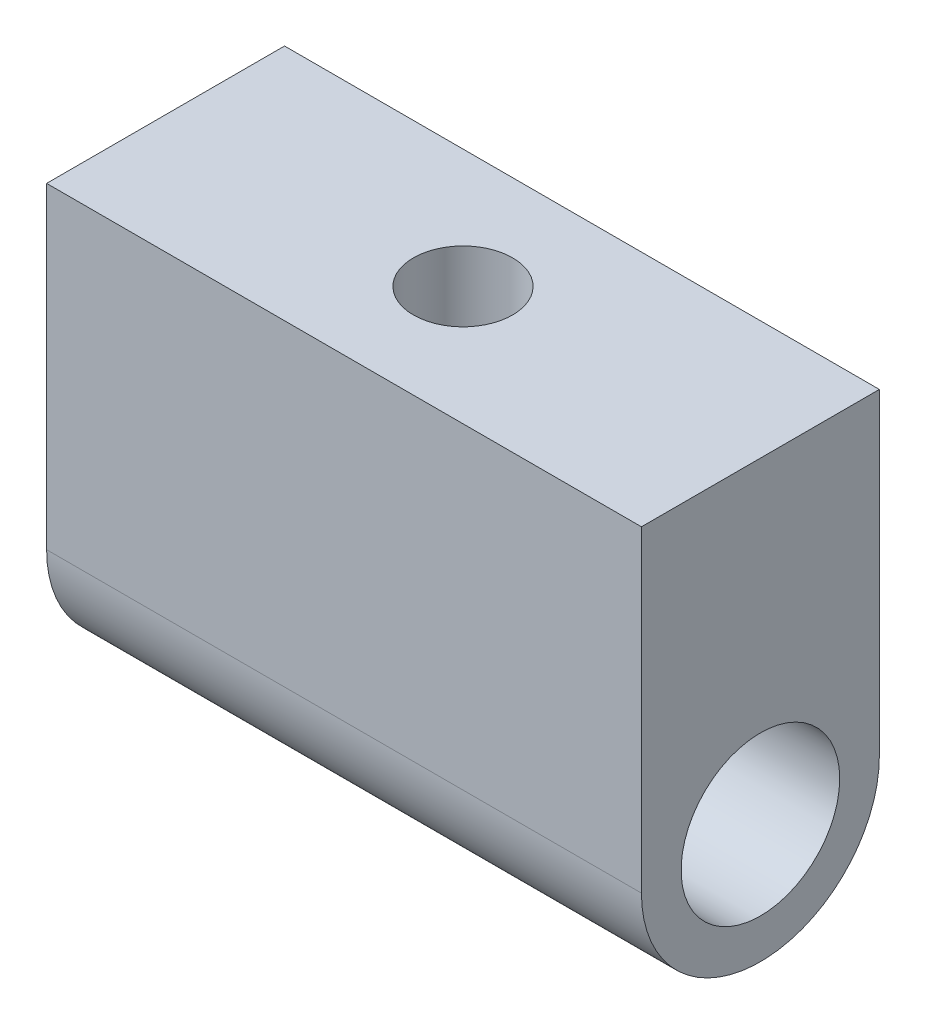
ISO-10303-21;
HEADER;
FILE_DESCRIPTION(('STEP AP214'),'2;1');
FILE_NAME('part.step','',(''),(''),'','','');
FILE_SCHEMA(('AUTOMOTIVE_DESIGN { 1 0 10303 214 1 1 1 1 }'));
ENDSEC;
DATA;
#1=APPLICATION_CONTEXT('core data for automotive mechanical design processes');
#2=APPLICATION_PROTOCOL_DEFINITION('international standard','automotive_design',2000,#1);
#3=PRODUCT_CONTEXT('',#1,'mechanical');
#4=PRODUCT('Part','Part','',(#3));
#5=PRODUCT_RELATED_PRODUCT_CATEGORY('part','',(#4));
#6=PRODUCT_DEFINITION_FORMATION('','',#4);
#7=PRODUCT_DEFINITION_CONTEXT('part definition',#1,'design');
#8=PRODUCT_DEFINITION('design','',#6,#7);
#9=PRODUCT_DEFINITION_SHAPE('','',#8);
#10=(LENGTH_UNIT() NAMED_UNIT(*) SI_UNIT(.MILLI.,.METRE.));
#11=(NAMED_UNIT(*) PLANE_ANGLE_UNIT() SI_UNIT($,.RADIAN.));
#12=(NAMED_UNIT(*) SI_UNIT($,.STERADIAN.) SOLID_ANGLE_UNIT());
#13=UNCERTAINTY_MEASURE_WITH_UNIT(LENGTH_MEASURE(1.E-05),#10,'distance_accuracy_value','');
#14=(GEOMETRIC_REPRESENTATION_CONTEXT(3) GLOBAL_UNCERTAINTY_ASSIGNED_CONTEXT((#13)) GLOBAL_UNIT_ASSIGNED_CONTEXT((#10,
#11,#12)) REPRESENTATION_CONTEXT('',''));
#15=CARTESIAN_POINT('',(0.,0.,0.));
#16=DIRECTION('',(0.,0.,1.));
#17=DIRECTION('',(1.,0.,0.));
#18=AXIS2_PLACEMENT_3D('',#15,#16,#17);
#19=CARTESIAN_POINT('',(30.,-8.,0.));
#20=DIRECTION('',(1.,0.,0.));
#21=DIRECTION('',(0.,0.,-1.));
#22=AXIS2_PLACEMENT_3D('',#19,#20,#21);
#23=PLANE('',#22);
#24=CARTESIAN_POINT('',(30.,-8.,0.));
#25=DIRECTION('',(1.,0.,0.));
#26=DIRECTION('',(0.,0.,-1.));
#27=AXIS2_PLACEMENT_3D('',#24,#25,#26);
#28=CIRCLE('',#27,6.);
#29=CARTESIAN_POINT('',(30.,-8.,6.));
#30=VERTEX_POINT('',#29);
#31=CARTESIAN_POINT('',(30.,-8.,-6.));
#32=VERTEX_POINT('',#31);
#33=EDGE_CURVE('E91',#30,#32,#28,.T.);
#34=ORIENTED_EDGE('',*,*,#33,.T.);
#35=DIRECTION('',(0.,1.,0.));
#36=VECTOR('',#35,1.);
#37=CARTESIAN_POINT('',(30.,8.,-6.));
#38=LINE('',#37,#36);
#39=CARTESIAN_POINT('',(30.,8.,-6.));
#40=VERTEX_POINT('',#39);
#41=EDGE_CURVE('E86',#32,#40,#38,.T.);
#42=ORIENTED_EDGE('',*,*,#41,.T.);
#43=DIRECTION('',(0.,0.,1.));
#44=VECTOR('',#43,1.);
#45=CARTESIAN_POINT('',(30.,8.,6.));
#46=LINE('',#45,#44);
#47=CARTESIAN_POINT('',(30.,8.,6.));
#48=VERTEX_POINT('',#47);
#49=EDGE_CURVE('E89',#40,#48,#46,.T.);
#50=ORIENTED_EDGE('',*,*,#49,.T.);
#51=DIRECTION('',(0.,-1.,0.));
#52=VECTOR('',#51,1.);
#53=CARTESIAN_POINT('',(30.,8.,6.));
#54=LINE('',#53,#52);
#55=EDGE_CURVE('E56',#48,#30,#54,.T.);
#56=ORIENTED_EDGE('',*,*,#55,.T.);
#57=EDGE_LOOP('',(#34,#42,#50,#56));
#58=FACE_BOUND('',#57,.T.);
#59=CARTESIAN_POINT('',(30.,-8.,0.));
#60=DIRECTION('',(1.,0.,0.));
#61=DIRECTION('',(0.,0.,-1.));
#62=AXIS2_PLACEMENT_3D('',#59,#60,#61);
#63=CIRCLE('',#62,4.);
#64=CARTESIAN_POINT('',(30.,-8.,-4.));
#65=VERTEX_POINT('',#64);
#66=EDGE_CURVE('E106',#65,#65,#63,.T.);
#67=ORIENTED_EDGE('',*,*,#66,.F.);
#68=EDGE_LOOP('',(#67));
#69=FACE_BOUND('',#68,.T.);
#70=ADVANCED_FACE('F39',(#58,#69),#23,.T.);
#71=CARTESIAN_POINT('',(0.,-8.,0.));
#72=DIRECTION('',(1.,0.,0.));
#73=DIRECTION('',(0.,0.,-1.));
#74=AXIS2_PLACEMENT_3D('',#71,#72,#73);
#75=PLANE('',#74);
#76=CARTESIAN_POINT('',(0.,-8.,0.));
#77=DIRECTION('',(1.,0.,0.));
#78=DIRECTION('',(0.,0.,-1.));
#79=AXIS2_PLACEMENT_3D('',#76,#77,#78);
#80=CIRCLE('',#79,6.);
#81=CARTESIAN_POINT('',(0.,-8.,6.));
#82=VERTEX_POINT('',#81);
#83=CARTESIAN_POINT('',(0.,-8.,-6.));
#84=VERTEX_POINT('',#83);
#85=EDGE_CURVE('E103',#82,#84,#80,.T.);
#86=ORIENTED_EDGE('',*,*,#85,.F.);
#87=DIRECTION('',(0.,-1.,0.));
#88=VECTOR('',#87,1.);
#89=CARTESIAN_POINT('',(0.,8.,6.));
#90=LINE('',#89,#88);
#91=CARTESIAN_POINT('',(0.,8.,6.));
#92=VERTEX_POINT('',#91);
#93=EDGE_CURVE('E79',#92,#82,#90,.T.);
#94=ORIENTED_EDGE('',*,*,#93,.F.);
#95=DIRECTION('',(0.,0.,1.));
#96=VECTOR('',#95,1.);
#97=CARTESIAN_POINT('',(0.,8.,6.));
#98=LINE('',#97,#96);
#99=CARTESIAN_POINT('',(0.,8.,-6.));
#100=VERTEX_POINT('',#99);
#101=EDGE_CURVE('E73',#100,#92,#98,.T.);
#102=ORIENTED_EDGE('',*,*,#101,.F.);
#103=DIRECTION('',(0.,1.,0.));
#104=VECTOR('',#103,1.);
#105=CARTESIAN_POINT('',(0.,8.,-6.));
#106=LINE('',#105,#104);
#107=EDGE_CURVE('E95',#84,#100,#106,.T.);
#108=ORIENTED_EDGE('',*,*,#107,.F.);
#109=EDGE_LOOP('',(#86,#94,#102,#108));
#110=FACE_BOUND('',#109,.T.);
#111=CARTESIAN_POINT('',(0.,-8.,0.));
#112=DIRECTION('',(1.,0.,0.));
#113=DIRECTION('',(0.,0.,-1.));
#114=AXIS2_PLACEMENT_3D('',#111,#112,#113);
#115=CIRCLE('',#114,4.);
#116=CARTESIAN_POINT('',(0.,-8.,-4.));
#117=VERTEX_POINT('',#116);
#118=EDGE_CURVE('E118',#117,#117,#115,.T.);
#119=ORIENTED_EDGE('',*,*,#118,.T.);
#120=EDGE_LOOP('',(#119));
#121=FACE_BOUND('',#120,.T.);
#122=ADVANCED_FACE('F114',(#110,#121),#75,.F.);
#123=CARTESIAN_POINT('',(30.,-8.,0.));
#124=DIRECTION('',(-1.,0.,0.));
#125=DIRECTION('',(0.,0.,1.));
#126=AXIS2_PLACEMENT_3D('',#123,#124,#125);
#127=CYLINDRICAL_SURFACE('',#126,6.);
#128=ORIENTED_EDGE('',*,*,#85,.T.);
#129=DIRECTION('',(-1.,0.,0.));
#130=VECTOR('',#129,1.);
#131=CARTESIAN_POINT('',(30.,-8.,-6.));
#132=LINE('',#131,#130);
#133=EDGE_CURVE('E11',#32,#84,#132,.T.);
#134=ORIENTED_EDGE('',*,*,#133,.F.);
#135=ORIENTED_EDGE('',*,*,#33,.F.);
#136=DIRECTION('',(-1.,0.,0.));
#137=VECTOR('',#136,1.);
#138=CARTESIAN_POINT('',(30.,-8.,6.));
#139=LINE('',#138,#137);
#140=EDGE_CURVE('E99',#30,#82,#139,.T.);
#141=ORIENTED_EDGE('',*,*,#140,.T.);
#142=EDGE_LOOP('',(#128,#134,#135,#141));
#143=FACE_BOUND('',#142,.T.);
#144=ADVANCED_FACE('F41',(#143),#127,.T.);
#145=CARTESIAN_POINT('',(30.,8.,-6.));
#146=DIRECTION('',(0.,0.,1.));
#147=DIRECTION('',(0.,-1.,0.));
#148=AXIS2_PLACEMENT_3D('',#145,#146,#147);
#149=PLANE('',#148);
#150=ORIENTED_EDGE('',*,*,#107,.T.);
#151=DIRECTION('',(-1.,0.,0.));
#152=VECTOR('',#151,1.);
#153=CARTESIAN_POINT('',(30.,8.,-6.));
#154=LINE('',#153,#152);
#155=EDGE_CURVE('E48',#40,#100,#154,.T.);
#156=ORIENTED_EDGE('',*,*,#155,.F.);
#157=ORIENTED_EDGE('',*,*,#41,.F.);
#158=ORIENTED_EDGE('',*,*,#133,.T.);
#159=EDGE_LOOP('',(#150,#156,#157,#158));
#160=FACE_BOUND('',#159,.T.);
#161=ADVANCED_FACE('F94',(#160),#149,.F.);
#162=CARTESIAN_POINT('',(30.,8.,6.));
#163=DIRECTION('',(0.,-1.,0.));
#164=DIRECTION('',(0.,0.,-1.));
#165=AXIS2_PLACEMENT_3D('',#162,#163,#164);
#166=PLANE('',#165);
#167=CARTESIAN_POINT('',(15.,8.,0.));
#168=DIRECTION('',(0.,1.,0.));
#169=DIRECTION('',(0.,0.,1.));
#170=AXIS2_PLACEMENT_3D('',#167,#168,#169);
#171=CIRCLE('',#170,2.5);
#172=CARTESIAN_POINT('',(15.,8.,2.5));
#173=VERTEX_POINT('',#172);
#174=EDGE_CURVE('E124',#173,#173,#171,.T.);
#175=ORIENTED_EDGE('',*,*,#174,.F.);
#176=EDGE_LOOP('',(#175));
#177=FACE_BOUND('',#176,.T.);
#178=ORIENTED_EDGE('',*,*,#101,.T.);
#179=DIRECTION('',(-1.,0.,0.));
#180=VECTOR('',#179,1.);
#181=CARTESIAN_POINT('',(30.,8.,6.));
#182=LINE('',#181,#180);
#183=EDGE_CURVE('E96',#48,#92,#182,.T.);
#184=ORIENTED_EDGE('',*,*,#183,.F.);
#185=ORIENTED_EDGE('',*,*,#49,.F.);
#186=ORIENTED_EDGE('',*,*,#155,.T.);
#187=EDGE_LOOP('',(#178,#184,#185,#186));
#188=FACE_BOUND('',#187,.T.);
#189=ADVANCED_FACE('F97',(#177,#188),#166,.F.);
#190=CARTESIAN_POINT('',(30.,8.,6.));
#191=DIRECTION('',(0.,0.,-1.));
#192=DIRECTION('',(0.,1.,0.));
#193=AXIS2_PLACEMENT_3D('',#190,#191,#192);
#194=PLANE('',#193);
#195=ORIENTED_EDGE('',*,*,#93,.T.);
#196=ORIENTED_EDGE('',*,*,#140,.F.);
#197=ORIENTED_EDGE('',*,*,#55,.F.);
#198=ORIENTED_EDGE('',*,*,#183,.T.);
#199=EDGE_LOOP('',(#195,#196,#197,#198));
#200=FACE_BOUND('',#199,.T.);
#201=ADVANCED_FACE('F111',(#200),#194,.F.);
#202=CARTESIAN_POINT('',(30.,-8.,0.));
#203=DIRECTION('',(-1.,0.,0.));
#204=DIRECTION('',(0.,0.,1.));
#205=AXIS2_PLACEMENT_3D('',#202,#203,#204);
#206=CYLINDRICAL_SURFACE('',#205,4.);
#207=ORIENTED_EDGE('',*,*,#66,.T.);
#208=EDGE_LOOP('',(#207));
#209=FACE_BOUND('',#208,.T.);
#210=ORIENTED_EDGE('',*,*,#118,.F.);
#211=EDGE_LOOP('',(#210));
#212=FACE_BOUND('',#211,.T.);
#213=ADVANCED_FACE('F135',(#209,#212),#206,.F.);
#214=CARTESIAN_POINT('',(15.,3.,0.));
#215=DIRECTION('',(0.,1.,0.));
#216=DIRECTION('',(0.,0.,1.));
#217=AXIS2_PLACEMENT_3D('',#214,#215,#216);
#218=CYLINDRICAL_SURFACE('',#217,2.5);
#219=CARTESIAN_POINT('',(15.,3.,0.));
#220=DIRECTION('',(0.,1.,0.));
#221=DIRECTION('',(0.,0.,1.));
#222=AXIS2_PLACEMENT_3D('',#219,#220,#221);
#223=CIRCLE('',#222,2.5);
#224=CARTESIAN_POINT('',(15.,3.,2.5));
#225=VERTEX_POINT('',#224);
#226=EDGE_CURVE('E121',#225,#225,#223,.T.);
#227=ORIENTED_EDGE('',*,*,#226,.F.);
#228=EDGE_LOOP('',(#227));
#229=FACE_BOUND('',#228,.T.);
#230=ORIENTED_EDGE('',*,*,#174,.T.);
#231=EDGE_LOOP('',(#230));
#232=FACE_BOUND('',#231,.T.);
#233=ADVANCED_FACE('F132',(#229,#232),#218,.F.);
#234=CARTESIAN_POINT('',(15.,3.,0.));
#235=DIRECTION('',(0.,1.,0.));
#236=DIRECTION('',(0.,0.,1.));
#237=AXIS2_PLACEMENT_3D('',#234,#235,#236);
#238=PLANE('',#237);
#239=ORIENTED_EDGE('',*,*,#226,.T.);
#240=EDGE_LOOP('',(#239));
#241=FACE_BOUND('',#240,.T.);
#242=ADVANCED_FACE('F130',(#241),#238,.T.);
#243=CLOSED_SHELL('',(#70,#122,#144,#161,#189,#201,#213,#233,#242));
#244=MANIFOLD_SOLID_BREP('B2',#243);
#245=ADVANCED_BREP_SHAPE_REPRESENTATION('',(#18,#244),#14);
#246=SHAPE_DEFINITION_REPRESENTATION(#9,#245);
ENDSEC;
END-ISO-10303-21;
